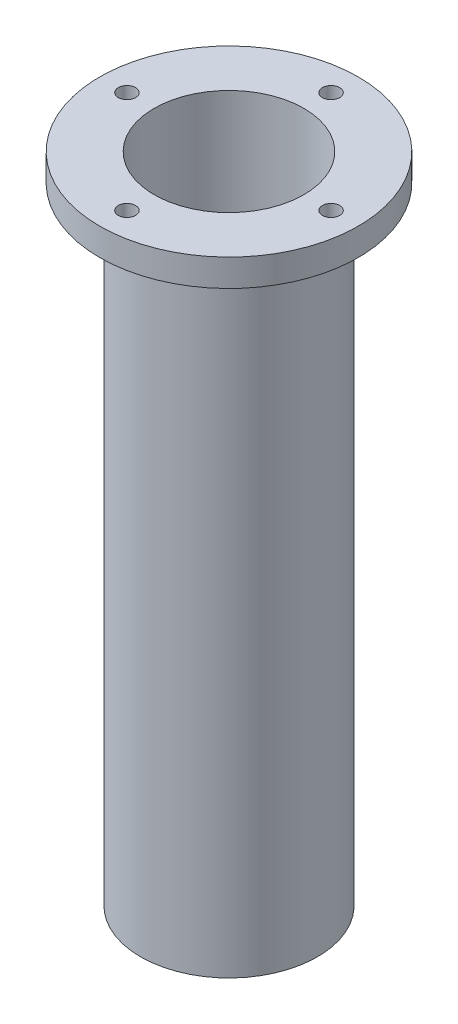
ISO-10303-21;
HEADER;
FILE_DESCRIPTION(('STEP AP214'),'2;1');
FILE_NAME('part.step','',(''),(''),'','','');
FILE_SCHEMA(('AUTOMOTIVE_DESIGN { 1 0 10303 214 1 1 1 1 }'));
ENDSEC;
DATA;
#1=APPLICATION_CONTEXT('core data for automotive mechanical design processes');
#2=APPLICATION_PROTOCOL_DEFINITION('international standard','automotive_design',2000,#1);
#3=PRODUCT_CONTEXT('',#1,'mechanical');
#4=PRODUCT('Part','Part','',(#3));
#5=PRODUCT_RELATED_PRODUCT_CATEGORY('part','',(#4));
#6=PRODUCT_DEFINITION_FORMATION('','',#4);
#7=PRODUCT_DEFINITION_CONTEXT('part definition',#1,'design');
#8=PRODUCT_DEFINITION('design','',#6,#7);
#9=PRODUCT_DEFINITION_SHAPE('','',#8);
#10=(LENGTH_UNIT() NAMED_UNIT(*) SI_UNIT(.MILLI.,.METRE.));
#11=(NAMED_UNIT(*) PLANE_ANGLE_UNIT() SI_UNIT($,.RADIAN.));
#12=(NAMED_UNIT(*) SI_UNIT($,.STERADIAN.) SOLID_ANGLE_UNIT());
#13=UNCERTAINTY_MEASURE_WITH_UNIT(LENGTH_MEASURE(1.E-05),#10,'distance_accuracy_value','');
#14=(GEOMETRIC_REPRESENTATION_CONTEXT(3) GLOBAL_UNCERTAINTY_ASSIGNED_CONTEXT((#13)) GLOBAL_UNIT_ASSIGNED_CONTEXT((#10,
#11,#12)) REPRESENTATION_CONTEXT('',''));
#15=CARTESIAN_POINT('',(0.,0.,0.));
#16=DIRECTION('',(0.,0.,1.));
#17=DIRECTION('',(1.,0.,0.));
#18=AXIS2_PLACEMENT_3D('',#15,#16,#17);
#19=CARTESIAN_POINT('',(0.,152.4,0.));
#20=DIRECTION('',(0.,-1.,0.));
#21=DIRECTION('',(0.,0.,-1.));
#22=AXIS2_PLACEMENT_3D('',#19,#20,#21);
#23=CYLINDRICAL_SURFACE('',#22,20.6375);
#24=CARTESIAN_POINT('',(0.,0.,0.));
#25=DIRECTION('',(0.,1.,0.));
#26=DIRECTION('',(0.,0.,1.));
#27=AXIS2_PLACEMENT_3D('',#24,#25,#26);
#28=CIRCLE('',#27,20.6375);
#29=CARTESIAN_POINT('',(0.,0.,-20.6375));
#30=VERTEX_POINT('',#29);
#31=EDGE_CURVE('E40',#30,#30,#28,.T.);
#32=CARTESIAN_POINT('',(0.,146.05,0.));
#33=DIRECTION('',(0.,1.,0.));
#34=DIRECTION('',(0.,0.,1.));
#35=AXIS2_PLACEMENT_3D('',#32,#33,#34);
#36=CIRCLE('',#35,20.6375);
#37=CARTESIAN_POINT('',(0.,146.05,-20.6375));
#38=VERTEX_POINT('',#37);
#39=EDGE_CURVE('E10',#38,#38,#36,.T.);
#40=CARTESIAN_POINT('',(0.,0.,-20.6375));
#41=CARTESIAN_POINT('',(0.,1.52135416666666,-20.6375));
#42=CARTESIAN_POINT('',(0.,3.04270833333333,-20.6375));
#43=CARTESIAN_POINT('',(0.,6.08541666666666,-20.6375));
#44=CARTESIAN_POINT('',(0.,7.60677083333332,-20.6375));
#45=CARTESIAN_POINT('',(0.,10.6494791666667,-20.6375));
#46=CARTESIAN_POINT('',(0.,12.1708333333333,-20.6375));
#47=CARTESIAN_POINT('',(0.,15.2135416666667,-20.6375));
#48=CARTESIAN_POINT('',(0.,16.7348958333333,-20.6375));
#49=CARTESIAN_POINT('',(0.,19.7776041666667,-20.6375));
#50=CARTESIAN_POINT('',(0.,21.2989583333333,-20.6375));
#51=CARTESIAN_POINT('',(0.,24.3416666666667,-20.6375));
#52=CARTESIAN_POINT('',(0.,25.8630208333333,-20.6375));
#53=CARTESIAN_POINT('',(0.,28.9057291666667,-20.6375));
#54=CARTESIAN_POINT('',(0.,30.4270833333333,-20.6375));
#55=CARTESIAN_POINT('',(0.,33.4697916666667,-20.6375));
#56=CARTESIAN_POINT('',(0.,34.9911458333333,-20.6375));
#57=CARTESIAN_POINT('',(0.,38.0338541666667,-20.6375));
#58=CARTESIAN_POINT('',(0.,39.5552083333333,-20.6375));
#59=CARTESIAN_POINT('',(0.,42.5979166666666,-20.6375));
#60=CARTESIAN_POINT('',(0.,44.1192708333333,-20.6375));
#61=CARTESIAN_POINT('',(0.,47.1619791666667,-20.6375));
#62=CARTESIAN_POINT('',(0.,48.6833333333333,-20.6375));
#63=CARTESIAN_POINT('',(0.,51.7260416666667,-20.6375));
#64=CARTESIAN_POINT('',(0.,53.2473958333333,-20.6375));
#65=CARTESIAN_POINT('',(0.,56.2901041666667,-20.6375));
#66=CARTESIAN_POINT('',(0.,57.8114583333333,-20.6375));
#67=CARTESIAN_POINT('',(0.,60.8541666666667,-20.6375));
#68=CARTESIAN_POINT('',(0.,62.3755208333333,-20.6375));
#69=CARTESIAN_POINT('',(0.,65.4182291666667,-20.6375));
#70=CARTESIAN_POINT('',(0.,66.9395833333333,-20.6375));
#71=CARTESIAN_POINT('',(0.,69.9822916666667,-20.6375));
#72=CARTESIAN_POINT('',(0.,71.5036458333333,-20.6375));
#73=CARTESIAN_POINT('',(0.,74.5463541666667,-20.6375));
#74=CARTESIAN_POINT('',(0.,76.0677083333333,-20.6375));
#75=CARTESIAN_POINT('',(0.,79.1104166666667,-20.6375));
#76=CARTESIAN_POINT('',(0.,80.6317708333333,-20.6375));
#77=CARTESIAN_POINT('',(0.,83.6744791666667,-20.6375));
#78=CARTESIAN_POINT('',(0.,85.1958333333333,-20.6375));
#79=CARTESIAN_POINT('',(0.,88.2385416666667,-20.6375));
#80=CARTESIAN_POINT('',(0.,89.7598958333333,-20.6375));
#81=CARTESIAN_POINT('',(0.,92.8026041666667,-20.6375));
#82=CARTESIAN_POINT('',(0.,94.3239583333333,-20.6375));
#83=CARTESIAN_POINT('',(0.,97.3666666666666,-20.6375));
#84=CARTESIAN_POINT('',(0.,98.8880208333333,-20.6375));
#85=CARTESIAN_POINT('',(0.,101.930729166667,-20.6375));
#86=CARTESIAN_POINT('',(0.,103.452083333333,-20.6375));
#87=CARTESIAN_POINT('',(0.,106.494791666667,-20.6375));
#88=CARTESIAN_POINT('',(0.,108.016145833333,-20.6375));
#89=CARTESIAN_POINT('',(0.,111.058854166667,-20.6375));
#90=CARTESIAN_POINT('',(0.,112.580208333333,-20.6375));
#91=CARTESIAN_POINT('',(0.,115.622916666667,-20.6375));
#92=CARTESIAN_POINT('',(0.,117.144270833333,-20.6375));
#93=CARTESIAN_POINT('',(0.,120.186979166667,-20.6375));
#94=CARTESIAN_POINT('',(0.,121.708333333333,-20.6375));
#95=CARTESIAN_POINT('',(0.,124.751041666667,-20.6375));
#96=CARTESIAN_POINT('',(0.,126.272395833333,-20.6375));
#97=CARTESIAN_POINT('',(0.,129.315104166667,-20.6375));
#98=CARTESIAN_POINT('',(0.,130.836458333333,-20.6375));
#99=CARTESIAN_POINT('',(0.,133.879166666667,-20.6375));
#100=CARTESIAN_POINT('',(0.,135.400520833333,-20.6375));
#101=CARTESIAN_POINT('',(0.,138.443229166667,-20.6375));
#102=CARTESIAN_POINT('',(0.,139.964583333333,-20.6375));
#103=CARTESIAN_POINT('',(0.,143.007291666667,-20.6375));
#104=CARTESIAN_POINT('',(0.,144.528645833333,-20.6375));
#105=CARTESIAN_POINT('',(0.,146.05,-20.6375));
#106=B_SPLINE_CURVE_WITH_KNOTS('',3,(#40,#41,#42,#43,#44,#45,#46,#47,#48,#49,#50,#51,#52,#53,
#54,#55,#56,#57,#58,#59,#60,#61,#62,#63,#64,#65,#66,#67,#68,#69,#70,#71,#72,#73,#74,#75,#76,#77,
#78,#79,#80,#81,#82,#83,#84,#85,#86,#87,#88,#89,#90,#91,#92,#93,#94,#95,#96,#97,#98,#99,#100,
#101,#102,#103,#104,#105),.UNSPECIFIED.,.F.,.F.,(4,2,2,2,2,2,2,2,2,2,2,2,2,2,2,2,2,2,2,2,2,2,2,
2,2,2,2,2,2,2,2,2,4),(0.,4.56406249999999,9.12812499999999,13.6921875,18.25625,22.8203125,
27.384375,31.9484375,36.5125,41.0765625,45.640625,50.2046875,54.76875,59.3328125,63.896875,
68.4609375,73.025,77.5890625,82.153125,86.7171875,91.28125,95.8453125,100.409375,104.9734375,
109.5375,114.1015625,118.665625,123.2296875,127.79375,132.3578125,136.921875,141.4859375,
146.05),.UNSPECIFIED.);
#107=EDGE_CURVE('BSEAM37',#30,#38,#106,.T.);
#108=ORIENTED_EDGE('',*,*,#31,.T.);
#109=ORIENTED_EDGE('',*,*,#39,.F.);
#110=ORIENTED_EDGE('',*,*,#107,.T.);
#111=ORIENTED_EDGE('',*,*,#107,.F.);
#112=EDGE_LOOP('',(#108,#110,#109,#111));
#113=FACE_BOUND('',#112,.T.);
#114=ADVANCED_FACE('F37',(#113),#23,.T.);
#115=CARTESIAN_POINT('',(0.,152.4,0.));
#116=DIRECTION('',(0.,1.,0.));
#117=DIRECTION('',(0.,0.,1.));
#118=AXIS2_PLACEMENT_3D('',#115,#116,#117);
#119=PLANE('',#118);
#120=CARTESIAN_POINT('',(-23.8125,152.4,0.));
#121=DIRECTION('',(0.,1.,0.));
#122=DIRECTION('',(0.,0.,1.));
#123=AXIS2_PLACEMENT_3D('',#120,#121,#122);
#124=CIRCLE('',#123,2.01929999999999);
#125=CARTESIAN_POINT('',(-23.8125,152.4,2.01929999999999));
#126=VERTEX_POINT('',#125);
#127=EDGE_CURVE('E85',#126,#126,#124,.T.);
#128=ORIENTED_EDGE('',*,*,#127,.F.);
#129=EDGE_LOOP('',(#128));
#130=FACE_BOUND('',#129,.T.);
#131=CARTESIAN_POINT('',(0.,152.4,-23.8125));
#132=DIRECTION('',(0.,1.,0.));
#133=DIRECTION('',(0.,0.,1.));
#134=AXIS2_PLACEMENT_3D('',#131,#132,#133);
#135=CIRCLE('',#134,2.01929999999999);
#136=CARTESIAN_POINT('',(0.,152.4,-21.7932));
#137=VERTEX_POINT('',#136);
#138=EDGE_CURVE('E79',#137,#137,#135,.T.);
#139=ORIENTED_EDGE('',*,*,#138,.F.);
#140=EDGE_LOOP('',(#139));
#141=FACE_BOUND('',#140,.T.);
#142=CARTESIAN_POINT('',(23.8125,152.4,0.));
#143=DIRECTION('',(0.,1.,0.));
#144=DIRECTION('',(0.,0.,1.));
#145=AXIS2_PLACEMENT_3D('',#142,#143,#144);
#146=CIRCLE('',#145,2.01929999999999);
#147=CARTESIAN_POINT('',(23.8125,152.4,2.01929999999999));
#148=VERTEX_POINT('',#147);
#149=EDGE_CURVE('E73',#148,#148,#146,.T.);
#150=ORIENTED_EDGE('',*,*,#149,.F.);
#151=EDGE_LOOP('',(#150));
#152=FACE_BOUND('',#151,.T.);
#153=CARTESIAN_POINT('',(0.,152.4,23.8125));
#154=DIRECTION('',(0.,1.,0.));
#155=DIRECTION('',(0.,0.,1.));
#156=AXIS2_PLACEMENT_3D('',#153,#154,#155);
#157=CIRCLE('',#156,2.01929999999999);
#158=CARTESIAN_POINT('',(0.,152.4,25.8318));
#159=VERTEX_POINT('',#158);
#160=EDGE_CURVE('E67',#159,#159,#157,.T.);
#161=ORIENTED_EDGE('',*,*,#160,.F.);
#162=EDGE_LOOP('',(#161));
#163=FACE_BOUND('',#162,.T.);
#164=CARTESIAN_POINT('',(0.,152.4,0.));
#165=DIRECTION('',(0.,1.,0.));
#166=DIRECTION('',(0.,0.,1.));
#167=AXIS2_PLACEMENT_3D('',#164,#165,#166);
#168=CIRCLE('',#167,17.4625);
#169=CARTESIAN_POINT('',(0.,152.4,-17.4625));
#170=VERTEX_POINT('',#169);
#171=EDGE_CURVE('E48',#170,#170,#168,.T.);
#172=ORIENTED_EDGE('',*,*,#171,.F.);
#173=EDGE_LOOP('',(#172));
#174=FACE_BOUND('',#173,.T.);
#175=CARTESIAN_POINT('',(0.,152.4,0.));
#176=DIRECTION('',(0.,1.,0.));
#177=DIRECTION('',(0.,0.,1.));
#178=AXIS2_PLACEMENT_3D('',#175,#176,#177);
#179=CIRCLE('',#178,30.1625);
#180=CARTESIAN_POINT('',(0.,152.4,30.1625));
#181=VERTEX_POINT('',#180);
#182=EDGE_CURVE('E51',#181,#181,#179,.T.);
#183=ORIENTED_EDGE('',*,*,#182,.T.);
#184=EDGE_LOOP('',(#183));
#185=FACE_BOUND('',#184,.T.);
#186=ADVANCED_FACE('F91',(#130,#141,#152,#163,#174,#185),#119,.T.);
#187=CARTESIAN_POINT('',(0.,0.,0.));
#188=DIRECTION('',(0.,1.,0.));
#189=DIRECTION('',(0.,0.,1.));
#190=AXIS2_PLACEMENT_3D('',#187,#188,#189);
#191=PLANE('',#190);
#192=ORIENTED_EDGE('',*,*,#31,.F.);
#193=EDGE_LOOP('',(#192));
#194=FACE_BOUND('',#193,.T.);
#195=CARTESIAN_POINT('',(0.,0.,0.));
#196=DIRECTION('',(0.,1.,0.));
#197=DIRECTION('',(0.,0.,1.));
#198=AXIS2_PLACEMENT_3D('',#195,#196,#197);
#199=CIRCLE('',#198,17.4625);
#200=CARTESIAN_POINT('',(0.,0.,-17.4625));
#201=VERTEX_POINT('',#200);
#202=EDGE_CURVE('E54',#201,#201,#199,.T.);
#203=ORIENTED_EDGE('',*,*,#202,.T.);
#204=EDGE_LOOP('',(#203));
#205=FACE_BOUND('',#204,.T.);
#206=ADVANCED_FACE('F94',(#194,#205),#191,.F.);
#207=CARTESIAN_POINT('',(0.,152.4,0.));
#208=DIRECTION('',(0.,-1.,0.));
#209=DIRECTION('',(0.,0.,-1.));
#210=AXIS2_PLACEMENT_3D('',#207,#208,#209);
#211=CYLINDRICAL_SURFACE('',#210,17.4625);
#212=CARTESIAN_POINT('',(0.,152.4,-17.4625));
#213=CARTESIAN_POINT('',(0.,150.8125,-17.4625));
#214=CARTESIAN_POINT('',(0.,149.225,-17.4625));
#215=CARTESIAN_POINT('',(0.,146.05,-17.4625));
#216=CARTESIAN_POINT('',(0.,144.4625,-17.4625));
#217=CARTESIAN_POINT('',(0.,141.2875,-17.4625));
#218=CARTESIAN_POINT('',(0.,139.7,-17.4625));
#219=CARTESIAN_POINT('',(0.,136.525,-17.4625));
#220=CARTESIAN_POINT('',(0.,134.9375,-17.4625));
#221=CARTESIAN_POINT('',(0.,131.7625,-17.4625));
#222=CARTESIAN_POINT('',(0.,130.175,-17.4625));
#223=CARTESIAN_POINT('',(0.,127.,-17.4625));
#224=CARTESIAN_POINT('',(0.,125.4125,-17.4625));
#225=CARTESIAN_POINT('',(0.,122.2375,-17.4625));
#226=CARTESIAN_POINT('',(0.,120.65,-17.4625));
#227=CARTESIAN_POINT('',(0.,117.475,-17.4625));
#228=CARTESIAN_POINT('',(0.,115.8875,-17.4625));
#229=CARTESIAN_POINT('',(0.,112.7125,-17.4625));
#230=CARTESIAN_POINT('',(0.,111.125,-17.4625));
#231=CARTESIAN_POINT('',(0.,107.95,-17.4625));
#232=CARTESIAN_POINT('',(0.,106.3625,-17.4625));
#233=CARTESIAN_POINT('',(0.,103.1875,-17.4625));
#234=CARTESIAN_POINT('',(0.,101.6,-17.4625));
#235=CARTESIAN_POINT('',(0.,98.425,-17.4625));
#236=CARTESIAN_POINT('',(0.,96.8375,-17.4625));
#237=CARTESIAN_POINT('',(0.,93.6625,-17.4625));
#238=CARTESIAN_POINT('',(0.,92.075,-17.4625));
#239=CARTESIAN_POINT('',(0.,88.9,-17.4625));
#240=CARTESIAN_POINT('',(0.,87.3125,-17.4625));
#241=CARTESIAN_POINT('',(0.,84.1375,-17.4625));
#242=CARTESIAN_POINT('',(0.,82.55,-17.4625));
#243=CARTESIAN_POINT('',(0.,79.375,-17.4625));
#244=CARTESIAN_POINT('',(0.,77.7875,-17.4625));
#245=CARTESIAN_POINT('',(0.,74.6125,-17.4625));
#246=CARTESIAN_POINT('',(0.,73.025,-17.4625));
#247=CARTESIAN_POINT('',(0.,69.85,-17.4625));
#248=CARTESIAN_POINT('',(0.,68.2625,-17.4625));
#249=CARTESIAN_POINT('',(0.,65.0875,-17.4625));
#250=CARTESIAN_POINT('',(0.,63.5,-17.4625));
#251=CARTESIAN_POINT('',(0.,60.325,-17.4625));
#252=CARTESIAN_POINT('',(0.,58.7375,-17.4625));
#253=CARTESIAN_POINT('',(0.,55.5625,-17.4625));
#254=CARTESIAN_POINT('',(0.,53.975,-17.4625));
#255=CARTESIAN_POINT('',(0.,50.8,-17.4625));
#256=CARTESIAN_POINT('',(0.,49.2125,-17.4625));
#257=CARTESIAN_POINT('',(0.,46.0375,-17.4625));
#258=CARTESIAN_POINT('',(0.,44.45,-17.4625));
#259=CARTESIAN_POINT('',(0.,41.275,-17.4625));
#260=CARTESIAN_POINT('',(0.,39.6875,-17.4625));
#261=CARTESIAN_POINT('',(0.,36.5125,-17.4625));
#262=CARTESIAN_POINT('',(0.,34.925,-17.4625));
#263=CARTESIAN_POINT('',(0.,31.75,-17.4625));
#264=CARTESIAN_POINT('',(0.,30.1625,-17.4625));
#265=CARTESIAN_POINT('',(0.,26.9875,-17.4625));
#266=CARTESIAN_POINT('',(0.,25.4,-17.4625));
#267=CARTESIAN_POINT('',(0.,22.225,-17.4625));
#268=CARTESIAN_POINT('',(0.,20.6375,-17.4625));
#269=CARTESIAN_POINT('',(0.,17.4625,-17.4625));
#270=CARTESIAN_POINT('',(0.,15.875,-17.4625));
#271=CARTESIAN_POINT('',(0.,12.7,-17.4625));
#272=CARTESIAN_POINT('',(0.,11.1125,-17.4625));
#273=CARTESIAN_POINT('',(0.,7.93750000000001,-17.4625));
#274=CARTESIAN_POINT('',(0.,6.35,-17.4625));
#275=CARTESIAN_POINT('',(0.,3.175,-17.4625));
#276=CARTESIAN_POINT('',(0.,1.5875,-17.4625));
#277=CARTESIAN_POINT('',(0.,0.,-17.4625));
#278=B_SPLINE_CURVE_WITH_KNOTS('',3,(#212,#213,#214,#215,#216,#217,#218,#219,#220,#221,#222,
#223,#224,#225,#226,#227,#228,#229,#230,#231,#232,#233,#234,#235,#236,#237,#238,#239,#240,#241,
#242,#243,#244,#245,#246,#247,#248,#249,#250,#251,#252,#253,#254,#255,#256,#257,#258,#259,#260,
#261,#262,#263,#264,#265,#266,#267,#268,#269,#270,#271,#272,#273,#274,#275,#276,#277),
.UNSPECIFIED.,.F.,.F.,(4,2,2,2,2,2,2,2,2,2,2,2,2,2,2,2,2,2,2,2,2,2,2,2,2,2,2,2,2,2,2,2,4),(0.,
4.76249999999998,9.52499999999998,14.2875,19.05,23.8125,28.575,33.3375,38.1,42.8625,47.625,
52.3875,57.15,61.9125,66.675,71.4375,76.2,80.9625,85.725,90.4875,95.25,100.0125,104.775,
109.5375,114.3,119.0625,123.825,128.5875,133.35,138.1125,142.875,147.6375,152.4),.UNSPECIFIED.);
#279=EDGE_CURVE('BSEAM118',#170,#201,#278,.T.);
#280=ORIENTED_EDGE('',*,*,#171,.T.);
#281=ORIENTED_EDGE('',*,*,#202,.F.);
#282=ORIENTED_EDGE('',*,*,#279,.T.);
#283=ORIENTED_EDGE('',*,*,#279,.F.);
#284=EDGE_LOOP('',(#280,#282,#281,#283));
#285=FACE_BOUND('',#284,.T.);
#286=ADVANCED_FACE('F118',(#285),#211,.F.);
#287=CARTESIAN_POINT('',(0.,146.05,0.));
#288=DIRECTION('',(0.,1.,0.));
#289=DIRECTION('',(0.,0.,1.));
#290=AXIS2_PLACEMENT_3D('',#287,#288,#289);
#291=PLANE('',#290);
#292=CARTESIAN_POINT('',(-23.8125,146.05,0.));
#293=DIRECTION('',(0.,1.,0.));
#294=DIRECTION('',(0.,0.,1.));
#295=AXIS2_PLACEMENT_3D('',#292,#293,#294);
#296=CIRCLE('',#295,2.01929999999998);
#297=CARTESIAN_POINT('',(-23.8125,146.05,2.01929999999998));
#298=VERTEX_POINT('',#297);
#299=EDGE_CURVE('E82',#298,#298,#296,.T.);
#300=ORIENTED_EDGE('',*,*,#299,.T.);
#301=EDGE_LOOP('',(#300));
#302=FACE_BOUND('',#301,.T.);
#303=CARTESIAN_POINT('',(0.,146.05,-23.8125));
#304=DIRECTION('',(0.,1.,0.));
#305=DIRECTION('',(0.,0.,1.));
#306=AXIS2_PLACEMENT_3D('',#303,#304,#305);
#307=CIRCLE('',#306,2.01929999999998);
#308=CARTESIAN_POINT('',(0.,146.05,-21.7932));
#309=VERTEX_POINT('',#308);
#310=EDGE_CURVE('E76',#309,#309,#307,.T.);
#311=ORIENTED_EDGE('',*,*,#310,.T.);
#312=EDGE_LOOP('',(#311));
#313=FACE_BOUND('',#312,.T.);
#314=CARTESIAN_POINT('',(23.8125,146.05,0.));
#315=DIRECTION('',(0.,1.,0.));
#316=DIRECTION('',(0.,0.,1.));
#317=AXIS2_PLACEMENT_3D('',#314,#315,#316);
#318=CIRCLE('',#317,2.01929999999998);
#319=CARTESIAN_POINT('',(23.8125,146.05,2.01929999999998));
#320=VERTEX_POINT('',#319);
#321=EDGE_CURVE('E70',#320,#320,#318,.T.);
#322=ORIENTED_EDGE('',*,*,#321,.T.);
#323=EDGE_LOOP('',(#322));
#324=FACE_BOUND('',#323,.T.);
#325=CARTESIAN_POINT('',(0.,146.05,23.8125));
#326=DIRECTION('',(0.,1.,0.));
#327=DIRECTION('',(0.,0.,1.));
#328=AXIS2_PLACEMENT_3D('',#325,#326,#327);
#329=CIRCLE('',#328,2.01929999999998);
#330=CARTESIAN_POINT('',(0.,146.05,25.8318));
#331=VERTEX_POINT('',#330);
#332=EDGE_CURVE('E63',#331,#331,#329,.T.);
#333=ORIENTED_EDGE('',*,*,#332,.T.);
#334=EDGE_LOOP('',(#333));
#335=FACE_BOUND('',#334,.T.);
#336=CARTESIAN_POINT('',(0.,146.05,0.));
#337=DIRECTION('',(0.,1.,0.));
#338=DIRECTION('',(0.,0.,1.));
#339=AXIS2_PLACEMENT_3D('',#336,#337,#338);
#340=CIRCLE('',#339,30.1625);
#341=CARTESIAN_POINT('',(0.,146.05,30.1625));
#342=VERTEX_POINT('',#341);
#343=EDGE_CURVE('E56',#342,#342,#340,.T.);
#344=ORIENTED_EDGE('',*,*,#343,.F.);
#345=EDGE_LOOP('',(#344));
#346=FACE_BOUND('',#345,.T.);
#347=ORIENTED_EDGE('',*,*,#39,.T.);
#348=EDGE_LOOP('',(#347));
#349=FACE_BOUND('',#348,.T.);
#350=ADVANCED_FACE('F109',(#302,#313,#324,#335,#346,#349),#291,.F.);
#351=CARTESIAN_POINT('',(0.,146.05,0.));
#352=DIRECTION('',(0.,1.,0.));
#353=DIRECTION('',(0.,0.,1.));
#354=AXIS2_PLACEMENT_3D('',#351,#352,#353);
#355=CYLINDRICAL_SURFACE('',#354,30.1625);
#356=ORIENTED_EDGE('',*,*,#343,.T.);
#357=EDGE_LOOP('',(#356));
#358=FACE_BOUND('',#357,.T.);
#359=ORIENTED_EDGE('',*,*,#182,.F.);
#360=EDGE_LOOP('',(#359));
#361=FACE_BOUND('',#360,.T.);
#362=ADVANCED_FACE('F106',(#358,#361),#355,.T.);
#363=CARTESIAN_POINT('',(0.,152.4,23.8125));
#364=DIRECTION('',(0.,1.,0.));
#365=DIRECTION('',(0.,0.,1.));
#366=AXIS2_PLACEMENT_3D('',#363,#364,#365);
#367=CYLINDRICAL_SURFACE('',#366,2.01929999999998);
#368=ORIENTED_EDGE('',*,*,#332,.F.);
#369=EDGE_LOOP('',(#368));
#370=FACE_BOUND('',#369,.T.);
#371=ORIENTED_EDGE('',*,*,#160,.T.);
#372=EDGE_LOOP('',(#371));
#373=FACE_BOUND('',#372,.T.);
#374=ADVANCED_FACE('F108',(#370,#373),#367,.F.);
#375=CARTESIAN_POINT('',(23.8125,152.4,0.));
#376=DIRECTION('',(0.,1.,0.));
#377=DIRECTION('',(0.,0.,1.));
#378=AXIS2_PLACEMENT_3D('',#375,#376,#377);
#379=CYLINDRICAL_SURFACE('',#378,2.01929999999998);
#380=ORIENTED_EDGE('',*,*,#321,.F.);
#381=EDGE_LOOP('',(#380));
#382=FACE_BOUND('',#381,.T.);
#383=ORIENTED_EDGE('',*,*,#149,.T.);
#384=EDGE_LOOP('',(#383));
#385=FACE_BOUND('',#384,.T.);
#386=ADVANCED_FACE('F115',(#382,#385),#379,.F.);
#387=CARTESIAN_POINT('',(0.,152.4,-23.8125));
#388=DIRECTION('',(0.,1.,0.));
#389=DIRECTION('',(0.,0.,1.));
#390=AXIS2_PLACEMENT_3D('',#387,#388,#389);
#391=CYLINDRICAL_SURFACE('',#390,2.01929999999998);
#392=ORIENTED_EDGE('',*,*,#310,.F.);
#393=EDGE_LOOP('',(#392));
#394=FACE_BOUND('',#393,.T.);
#395=ORIENTED_EDGE('',*,*,#138,.T.);
#396=EDGE_LOOP('',(#395));
#397=FACE_BOUND('',#396,.T.);
#398=ADVANCED_FACE('F162',(#394,#397),#391,.F.);
#399=CARTESIAN_POINT('',(-23.8125,152.4,0.));
#400=DIRECTION('',(0.,1.,0.));
#401=DIRECTION('',(0.,0.,1.));
#402=AXIS2_PLACEMENT_3D('',#399,#400,#401);
#403=CYLINDRICAL_SURFACE('',#402,2.01929999999998);
#404=ORIENTED_EDGE('',*,*,#299,.F.);
#405=EDGE_LOOP('',(#404));
#406=FACE_BOUND('',#405,.T.);
#407=ORIENTED_EDGE('',*,*,#127,.T.);
#408=EDGE_LOOP('',(#407));
#409=FACE_BOUND('',#408,.T.);
#410=ADVANCED_FACE('F89',(#406,#409),#403,.F.);
#411=CLOSED_SHELL('',(#114,#186,#206,#286,#350,#362,#374,#386,#398,#410));
#412=MANIFOLD_SOLID_BREP('B2',#411);
#413=ADVANCED_BREP_SHAPE_REPRESENTATION('',(#18,#412),#14);
#414=SHAPE_DEFINITION_REPRESENTATION(#9,#413);
ENDSEC;
END-ISO-10303-21;
